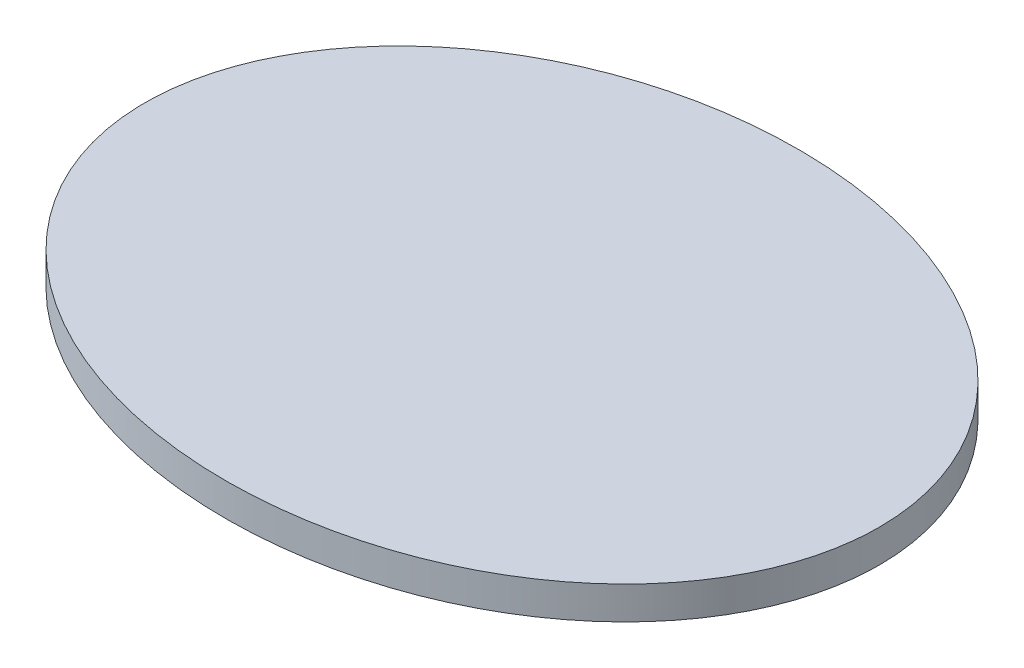
ISO-10303-21;
HEADER;
FILE_DESCRIPTION(('STEP AP214'),'2;1');
FILE_NAME('part.step','',(''),(''),'','','');
FILE_SCHEMA(('AUTOMOTIVE_DESIGN { 1 0 10303 214 1 1 1 1 }'));
ENDSEC;
DATA;
#1=APPLICATION_CONTEXT('core data for automotive mechanical design processes');
#2=APPLICATION_PROTOCOL_DEFINITION('international standard','automotive_design',2000,#1);
#3=PRODUCT_CONTEXT('',#1,'mechanical');
#4=PRODUCT('Part','Part','',(#3));
#5=PRODUCT_RELATED_PRODUCT_CATEGORY('part','',(#4));
#6=PRODUCT_DEFINITION_FORMATION('','',#4);
#7=PRODUCT_DEFINITION_CONTEXT('part definition',#1,'design');
#8=PRODUCT_DEFINITION('design','',#6,#7);
#9=PRODUCT_DEFINITION_SHAPE('','',#8);
#10=(LENGTH_UNIT() NAMED_UNIT(*) SI_UNIT(.MILLI.,.METRE.));
#11=(NAMED_UNIT(*) PLANE_ANGLE_UNIT() SI_UNIT($,.RADIAN.));
#12=(NAMED_UNIT(*) SI_UNIT($,.STERADIAN.) SOLID_ANGLE_UNIT());
#13=UNCERTAINTY_MEASURE_WITH_UNIT(LENGTH_MEASURE(1.E-05),#10,'distance_accuracy_value','');
#14=(GEOMETRIC_REPRESENTATION_CONTEXT(3) GLOBAL_UNCERTAINTY_ASSIGNED_CONTEXT((#13)) GLOBAL_UNIT_ASSIGNED_CONTEXT((#10,
#11,#12)) REPRESENTATION_CONTEXT('',''));
#15=CARTESIAN_POINT('',(0.,0.,0.));
#16=DIRECTION('',(0.,0.,1.));
#17=DIRECTION('',(1.,0.,0.));
#18=AXIS2_PLACEMENT_3D('',#15,#16,#17);
#19=CARTESIAN_POINT('',(0.,3.175,0.));
#20=DIRECTION('',(0.,1.,0.));
#21=DIRECTION('',(1.,0.,0.));
#22=AXIS2_PLACEMENT_3D('',#19,#20,#21);
#23=ELLIPSE('',#22,71.055615084371,55.4449117703804);
#24=DIRECTION('',(0.,-1.,0.));
#25=VECTOR('',#24,1.);
#26=SURFACE_OF_LINEAR_EXTRUSION('',#23,#25);
#27=CARTESIAN_POINT('',(71.055615084371,3.175,0.));
#28=VERTEX_POINT('',#27);
#29=EDGE_CURVE('E10',#28,#28,#23,.T.);
#30=ORIENTED_EDGE('',*,*,#29,.F.);
#31=EDGE_LOOP('',(#30));
#32=FACE_BOUND('',#31,.T.);
#33=CARTESIAN_POINT('',(0.,-3.175,0.));
#34=DIRECTION('',(0.,1.,0.));
#35=DIRECTION('',(1.,0.,0.));
#36=AXIS2_PLACEMENT_3D('',#33,#34,#35);
#37=ELLIPSE('',#36,71.055615084371,55.4449117703804);
#38=CARTESIAN_POINT('',(71.055615084371,-3.175,0.));
#39=VERTEX_POINT('',#38);
#40=EDGE_CURVE('E40',#39,#39,#37,.T.);
#41=ORIENTED_EDGE('',*,*,#40,.T.);
#42=EDGE_LOOP('',(#41));
#43=FACE_BOUND('',#42,.T.);
#44=ADVANCED_FACE('F36',(#32,#43),#26,.F.);
#45=CARTESIAN_POINT('',(0.,3.175,0.));
#46=DIRECTION('',(0.,1.,0.));
#47=DIRECTION('',(0.,0.,1.));
#48=AXIS2_PLACEMENT_3D('',#45,#46,#47);
#49=PLANE('',#48);
#50=ORIENTED_EDGE('',*,*,#29,.T.);
#51=EDGE_LOOP('',(#50));
#52=FACE_BOUND('',#51,.T.);
#53=ADVANCED_FACE('F52',(#52),#49,.T.);
#54=CARTESIAN_POINT('',(0.,-3.175,0.));
#55=DIRECTION('',(0.,1.,0.));
#56=DIRECTION('',(0.,0.,1.));
#57=AXIS2_PLACEMENT_3D('',#54,#55,#56);
#58=PLANE('',#57);
#59=ORIENTED_EDGE('',*,*,#40,.F.);
#60=EDGE_LOOP('',(#59));
#61=FACE_BOUND('',#60,.T.);
#62=ADVANCED_FACE('F50',(#61),#58,.F.);
#63=CLOSED_SHELL('',(#44,#53,#62));
#64=MANIFOLD_SOLID_BREP('B2',#63);
#65=ADVANCED_BREP_SHAPE_REPRESENTATION('',(#18,#64),#14);
#66=SHAPE_DEFINITION_REPRESENTATION(#9,#65);
ENDSEC;
END-ISO-10303-21;
